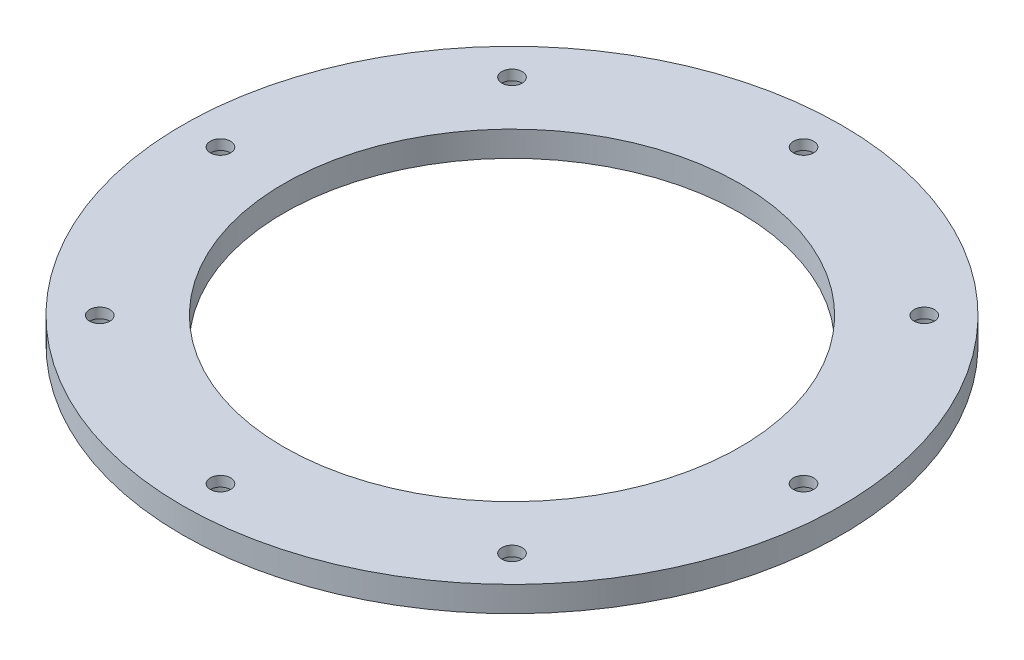
ISO-10303-21;
HEADER;
FILE_DESCRIPTION(('STEP AP214'),'2;1');
FILE_NAME('part.step','',(''),(''),'','','');
FILE_SCHEMA(('AUTOMOTIVE_DESIGN { 1 0 10303 214 1 1 1 1 }'));
ENDSEC;
DATA;
#1=APPLICATION_CONTEXT('core data for automotive mechanical design processes');
#2=APPLICATION_PROTOCOL_DEFINITION('international standard','automotive_design',2000,#1);
#3=PRODUCT_CONTEXT('',#1,'mechanical');
#4=PRODUCT('Part','Part','',(#3));
#5=PRODUCT_RELATED_PRODUCT_CATEGORY('part','',(#4));
#6=PRODUCT_DEFINITION_FORMATION('','',#4);
#7=PRODUCT_DEFINITION_CONTEXT('part definition',#1,'design');
#8=PRODUCT_DEFINITION('design','',#6,#7);
#9=PRODUCT_DEFINITION_SHAPE('','',#8);
#10=(LENGTH_UNIT() NAMED_UNIT(*) SI_UNIT(.MILLI.,.METRE.));
#11=(NAMED_UNIT(*) PLANE_ANGLE_UNIT() SI_UNIT($,.RADIAN.));
#12=(NAMED_UNIT(*) SI_UNIT($,.STERADIAN.) SOLID_ANGLE_UNIT());
#13=UNCERTAINTY_MEASURE_WITH_UNIT(LENGTH_MEASURE(1.E-05),#10,'distance_accuracy_value','');
#14=(GEOMETRIC_REPRESENTATION_CONTEXT(3) GLOBAL_UNCERTAINTY_ASSIGNED_CONTEXT((#13)) GLOBAL_UNIT_ASSIGNED_CONTEXT((#10,
#11,#12)) REPRESENTATION_CONTEXT('',''));
#15=CARTESIAN_POINT('',(0.,0.,0.));
#16=DIRECTION('',(0.,0.,1.));
#17=DIRECTION('',(1.,0.,0.));
#18=AXIS2_PLACEMENT_3D('',#15,#16,#17);
#19=CARTESIAN_POINT('',(0.,10.,0.));
#20=DIRECTION('',(0.,1.,0.));
#21=DIRECTION('',(0.,0.,1.));
#22=AXIS2_PLACEMENT_3D('',#19,#20,#21);
#23=PLANE('',#22);
#24=CARTESIAN_POINT('',(115.,10.,-4.04593397457117E-13));
#25=DIRECTION('',(0.,1.,0.));
#26=DIRECTION('',(0.,0.,1.));
#27=AXIS2_PLACEMENT_3D('',#24,#25,#26);
#28=CIRCLE('',#27,4.);
#29=CARTESIAN_POINT('',(115.,10.,3.9999999999996));
#30=VERTEX_POINT('',#29);
#31=EDGE_CURVE('E161',#30,#30,#28,.F.);
#32=ORIENTED_EDGE('',*,*,#31,.T.);
#33=EDGE_LOOP('',(#32));
#34=FACE_BOUND('',#33,.T.);
#35=CARTESIAN_POINT('',(81.3172798364525,10.,-81.3172798364534));
#36=DIRECTION('',(0.,1.,0.));
#37=DIRECTION('',(0.,0.,1.));
#38=AXIS2_PLACEMENT_3D('',#35,#36,#37);
#39=CIRCLE('',#38,4.);
#40=CARTESIAN_POINT('',(81.3172798364525,10.,-77.3172798364534));
#41=VERTEX_POINT('',#40);
#42=EDGE_CURVE('E165',#41,#41,#39,.F.);
#43=ORIENTED_EDGE('',*,*,#42,.T.);
#44=EDGE_LOOP('',(#43));
#45=FACE_BOUND('',#44,.T.);
#46=CARTESIAN_POINT('',(0.,10.,-115.));
#47=DIRECTION('',(0.,1.,0.));
#48=DIRECTION('',(0.,0.,1.));
#49=AXIS2_PLACEMENT_3D('',#46,#47,#48);
#50=CIRCLE('',#49,4.);
#51=CARTESIAN_POINT('',(0.,10.,-111.));
#52=VERTEX_POINT('',#51);
#53=EDGE_CURVE('E169',#52,#52,#50,.F.);
#54=ORIENTED_EDGE('',*,*,#53,.T.);
#55=EDGE_LOOP('',(#54));
#56=FACE_BOUND('',#55,.T.);
#57=CARTESIAN_POINT('',(-81.3172798364537,10.,-81.3172798364523));
#58=DIRECTION('',(0.,1.,0.));
#59=DIRECTION('',(0.,0.,1.));
#60=AXIS2_PLACEMENT_3D('',#57,#58,#59);
#61=CIRCLE('',#60,4.);
#62=CARTESIAN_POINT('',(-81.3172798364537,10.,-77.3172798364523));
#63=VERTEX_POINT('',#62);
#64=EDGE_CURVE('E173',#63,#63,#61,.F.);
#65=ORIENTED_EDGE('',*,*,#64,.T.);
#66=EDGE_LOOP('',(#65));
#67=FACE_BOUND('',#66,.T.);
#68=CARTESIAN_POINT('',(-115.,10.,1.20763410539104E-12));
#69=DIRECTION('',(0.,1.,0.));
#70=DIRECTION('',(0.,0.,1.));
#71=AXIS2_PLACEMENT_3D('',#68,#69,#70);
#72=CIRCLE('',#71,4.);
#73=CARTESIAN_POINT('',(-115.,10.,4.00000000000121));
#74=VERTEX_POINT('',#73);
#75=EDGE_CURVE('E177',#74,#74,#72,.F.);
#76=ORIENTED_EDGE('',*,*,#75,.T.);
#77=EDGE_LOOP('',(#76));
#78=FACE_BOUND('',#77,.T.);
#79=CARTESIAN_POINT('',(-81.317279836452,10.,81.3172798364539));
#80=DIRECTION('',(0.,1.,0.));
#81=DIRECTION('',(0.,0.,1.));
#82=AXIS2_PLACEMENT_3D('',#79,#80,#81);
#83=CIRCLE('',#82,4.);
#84=CARTESIAN_POINT('',(-81.317279836452,10.,85.317279836454));
#85=VERTEX_POINT('',#84);
#86=EDGE_CURVE('E181',#85,#85,#83,.F.);
#87=ORIENTED_EDGE('',*,*,#86,.T.);
#88=EDGE_LOOP('',(#87));
#89=FACE_BOUND('',#88,.T.);
#90=CARTESIAN_POINT('',(81.3172798364531,10.,81.3172798364528));
#91=DIRECTION('',(0.,1.,0.));
#92=DIRECTION('',(0.,0.,1.));
#93=AXIS2_PLACEMENT_3D('',#90,#91,#92);
#94=CIRCLE('',#93,4.);
#95=CARTESIAN_POINT('',(81.3172798364531,10.,85.3172798364528));
#96=VERTEX_POINT('',#95);
#97=EDGE_CURVE('E65',#96,#96,#94,.F.);
#98=ORIENTED_EDGE('',*,*,#97,.T.);
#99=EDGE_LOOP('',(#98));
#100=FACE_BOUND('',#99,.T.);
#101=CARTESIAN_POINT('',(0.,10.,115.));
#102=DIRECTION('',(0.,1.,0.));
#103=DIRECTION('',(0.,0.,1.));
#104=AXIS2_PLACEMENT_3D('',#101,#102,#103);
#105=CIRCLE('',#104,4.);
#106=CARTESIAN_POINT('',(0.,10.,119.));
#107=VERTEX_POINT('',#106);
#108=EDGE_CURVE('E60',#107,#107,#105,.F.);
#109=ORIENTED_EDGE('',*,*,#108,.T.);
#110=EDGE_LOOP('',(#109));
#111=FACE_BOUND('',#110,.T.);
#112=CARTESIAN_POINT('',(0.,10.,0.));
#113=DIRECTION('',(0.,1.,0.));
#114=DIRECTION('',(0.,0.,1.));
#115=AXIS2_PLACEMENT_3D('',#112,#113,#114);
#116=CIRCLE('',#115,130.);
#117=CARTESIAN_POINT('',(0.,10.,130.));
#118=VERTEX_POINT('',#117);
#119=EDGE_CURVE('E10',#118,#118,#116,.T.);
#120=ORIENTED_EDGE('',*,*,#119,.T.);
#121=EDGE_LOOP('',(#120));
#122=FACE_BOUND('',#121,.T.);
#123=CARTESIAN_POINT('',(0.,10.,0.));
#124=DIRECTION('',(0.,1.,0.));
#125=DIRECTION('',(0.,0.,1.));
#126=AXIS2_PLACEMENT_3D('',#123,#124,#125);
#127=CIRCLE('',#126,90.);
#128=CARTESIAN_POINT('',(0.,10.,90.));
#129=VERTEX_POINT('',#128);
#130=EDGE_CURVE('E50',#129,#129,#127,.T.);
#131=ORIENTED_EDGE('',*,*,#130,.F.);
#132=EDGE_LOOP('',(#131));
#133=FACE_BOUND('',#132,.T.);
#134=ADVANCED_FACE('F37',(#34,#45,#56,#67,#78,#89,#100,#111,#122,#133),#23,.T.);
#135=CARTESIAN_POINT('',(0.,0.,0.));
#136=DIRECTION('',(0.,1.,0.));
#137=DIRECTION('',(0.,0.,1.));
#138=AXIS2_PLACEMENT_3D('',#135,#136,#137);
#139=PLANE('',#138);
#140=CARTESIAN_POINT('',(115.,0.,-4.04593397457117E-13));
#141=DIRECTION('',(0.,-1.,0.));
#142=DIRECTION('',(-1.,0.,0.));
#143=AXIS2_PLACEMENT_3D('',#140,#141,#142);
#144=CIRCLE('',#143,7.5);
#145=CARTESIAN_POINT('',(107.5,0.,-3.78407287415793E-13));
#146=VERTEX_POINT('',#145);
#147=EDGE_CURVE('E98',#146,#146,#144,.T.);
#148=ORIENTED_EDGE('',*,*,#147,.F.);
#149=EDGE_LOOP('',(#148));
#150=FACE_BOUND('',#149,.T.);
#151=CARTESIAN_POINT('',(81.3172798364525,0.,-81.3172798364534));
#152=DIRECTION('',(0.,-1.,0.));
#153=DIRECTION('',(-0.707106781186544,0.,0.707106781186551));
#154=AXIS2_PLACEMENT_3D('',#151,#152,#153);
#155=CIRCLE('',#154,7.5);
#156=CARTESIAN_POINT('',(76.0139789775535,0.,-76.0139789775543));
#157=VERTEX_POINT('',#156);
#158=EDGE_CURVE('E104',#157,#157,#155,.T.);
#159=ORIENTED_EDGE('',*,*,#158,.F.);
#160=EDGE_LOOP('',(#159));
#161=FACE_BOUND('',#160,.T.);
#162=CARTESIAN_POINT('',(0.,0.,-115.));
#163=DIRECTION('',(0.,-1.,0.));
#164=DIRECTION('',(0.,0.,1.));
#165=AXIS2_PLACEMENT_3D('',#162,#163,#164);
#166=CIRCLE('',#165,7.5);
#167=CARTESIAN_POINT('',(0.,0.,-107.5));
#168=VERTEX_POINT('',#167);
#169=EDGE_CURVE('E110',#168,#168,#166,.T.);
#170=ORIENTED_EDGE('',*,*,#169,.F.);
#171=EDGE_LOOP('',(#170));
#172=FACE_BOUND('',#171,.T.);
#173=CARTESIAN_POINT('',(-81.3172798364537,0.,-81.3172798364523));
#174=DIRECTION('',(0.,-1.,0.));
#175=DIRECTION('',(0.707106781186554,0.,0.707106781186541));
#176=AXIS2_PLACEMENT_3D('',#173,#174,#175);
#177=CIRCLE('',#176,7.5);
#178=CARTESIAN_POINT('',(-76.0139789775545,0.,-76.0139789775532));
#179=VERTEX_POINT('',#178);
#180=EDGE_CURVE('E116',#179,#179,#177,.T.);
#181=ORIENTED_EDGE('',*,*,#180,.F.);
#182=EDGE_LOOP('',(#181));
#183=FACE_BOUND('',#182,.T.);
#184=CARTESIAN_POINT('',(-115.,0.,1.20763410539104E-12));
#185=DIRECTION('',(0.,-1.,0.));
#186=DIRECTION('',(1.,0.,0.));
#187=AXIS2_PLACEMENT_3D('',#184,#185,#186);
#188=CIRCLE('',#187,7.5);
#189=CARTESIAN_POINT('',(-107.5,0.,1.12907577526707E-12));
#190=VERTEX_POINT('',#189);
#191=EDGE_CURVE('E90',#190,#190,#188,.T.);
#192=ORIENTED_EDGE('',*,*,#191,.F.);
#193=EDGE_LOOP('',(#192));
#194=FACE_BOUND('',#193,.T.);
#195=CARTESIAN_POINT('',(-81.317279836452,0.,81.3172798364539));
#196=DIRECTION('',(0.,-1.,0.));
#197=DIRECTION('',(0.707106781186539,0.,-0.707106781186556));
#198=AXIS2_PLACEMENT_3D('',#195,#196,#197);
#199=CIRCLE('',#198,7.5);
#200=CARTESIAN_POINT('',(-76.0139789775529,0.,76.0139789775548));
#201=VERTEX_POINT('',#200);
#202=EDGE_CURVE('E81',#201,#201,#199,.T.);
#203=ORIENTED_EDGE('',*,*,#202,.F.);
#204=EDGE_LOOP('',(#203));
#205=FACE_BOUND('',#204,.T.);
#206=CARTESIAN_POINT('',(81.3172798364531,0.,81.3172798364528));
#207=DIRECTION('',(0.,-1.,0.));
#208=DIRECTION('',(-0.707106781186549,0.,-0.707106781186546));
#209=AXIS2_PLACEMENT_3D('',#206,#207,#208);
#210=CIRCLE('',#209,7.5);
#211=CARTESIAN_POINT('',(76.013978977554,0.,76.0139789775537));
#212=VERTEX_POINT('',#211);
#213=EDGE_CURVE('E97',#212,#212,#210,.T.);
#214=ORIENTED_EDGE('',*,*,#213,.F.);
#215=EDGE_LOOP('',(#214));
#216=FACE_BOUND('',#215,.T.);
#217=CARTESIAN_POINT('',(0.,0.,115.));
#218=DIRECTION('',(0.,-1.,0.));
#219=DIRECTION('',(0.,0.,-1.));
#220=AXIS2_PLACEMENT_3D('',#217,#218,#219);
#221=CIRCLE('',#220,7.5);
#222=CARTESIAN_POINT('',(0.,0.,107.5));
#223=VERTEX_POINT('',#222);
#224=EDGE_CURVE('E59',#223,#223,#221,.T.);
#225=ORIENTED_EDGE('',*,*,#224,.F.);
#226=EDGE_LOOP('',(#225));
#227=FACE_BOUND('',#226,.T.);
#228=CARTESIAN_POINT('',(0.,0.,0.));
#229=DIRECTION('',(0.,1.,0.));
#230=DIRECTION('',(0.,0.,1.));
#231=AXIS2_PLACEMENT_3D('',#228,#229,#230);
#232=CIRCLE('',#231,130.);
#233=CARTESIAN_POINT('',(0.,0.,130.));
#234=VERTEX_POINT('',#233);
#235=EDGE_CURVE('E45',#234,#234,#232,.T.);
#236=ORIENTED_EDGE('',*,*,#235,.F.);
#237=EDGE_LOOP('',(#236));
#238=FACE_BOUND('',#237,.T.);
#239=CARTESIAN_POINT('',(0.,0.,0.));
#240=DIRECTION('',(0.,1.,0.));
#241=DIRECTION('',(0.,0.,1.));
#242=AXIS2_PLACEMENT_3D('',#239,#240,#241);
#243=CIRCLE('',#242,90.);
#244=CARTESIAN_POINT('',(0.,0.,90.));
#245=VERTEX_POINT('',#244);
#246=EDGE_CURVE('E53',#245,#245,#243,.T.);
#247=ORIENTED_EDGE('',*,*,#246,.T.);
#248=EDGE_LOOP('',(#247));
#249=FACE_BOUND('',#248,.T.);
#250=ADVANCED_FACE('F137',(#150,#161,#172,#183,#194,#205,#216,#227,#238,#249),#139,.F.);
#251=CARTESIAN_POINT('',(0.,10.,0.));
#252=DIRECTION('',(0.,-1.,0.));
#253=DIRECTION('',(0.,0.,-1.));
#254=AXIS2_PLACEMENT_3D('',#251,#252,#253);
#255=CYLINDRICAL_SURFACE('',#254,130.);
#256=ORIENTED_EDGE('',*,*,#119,.F.);
#257=EDGE_LOOP('',(#256));
#258=FACE_BOUND('',#257,.T.);
#259=ORIENTED_EDGE('',*,*,#235,.T.);
#260=EDGE_LOOP('',(#259));
#261=FACE_BOUND('',#260,.T.);
#262=ADVANCED_FACE('F39',(#258,#261),#255,.T.);
#263=CARTESIAN_POINT('',(0.,10.,0.));
#264=DIRECTION('',(0.,-1.,0.));
#265=DIRECTION('',(0.,0.,-1.));
#266=AXIS2_PLACEMENT_3D('',#263,#264,#265);
#267=CYLINDRICAL_SURFACE('',#266,90.);
#268=ORIENTED_EDGE('',*,*,#130,.T.);
#269=EDGE_LOOP('',(#268));
#270=FACE_BOUND('',#269,.T.);
#271=ORIENTED_EDGE('',*,*,#246,.F.);
#272=EDGE_LOOP('',(#271));
#273=FACE_BOUND('',#272,.T.);
#274=ADVANCED_FACE('F139',(#270,#273),#267,.F.);
#275=CARTESIAN_POINT('',(0.,6.,115.));
#276=DIRECTION('',(0.,-1.,0.));
#277=DIRECTION('',(0.,0.,-1.));
#278=AXIS2_PLACEMENT_3D('',#275,#276,#277);
#279=CYLINDRICAL_SURFACE('',#278,7.5);
#280=CARTESIAN_POINT('',(0.,6.,115.));
#281=DIRECTION('',(0.,-1.,0.));
#282=DIRECTION('',(0.,0.,-1.));
#283=AXIS2_PLACEMENT_3D('',#280,#281,#282);
#284=CIRCLE('',#283,7.5);
#285=CARTESIAN_POINT('',(0.,6.,107.5));
#286=VERTEX_POINT('',#285);
#287=EDGE_CURVE('E127',#286,#286,#284,.T.);
#288=ORIENTED_EDGE('',*,*,#287,.F.);
#289=EDGE_LOOP('',(#288));
#290=FACE_BOUND('',#289,.T.);
#291=ORIENTED_EDGE('',*,*,#224,.T.);
#292=EDGE_LOOP('',(#291));
#293=FACE_BOUND('',#292,.T.);
#294=ADVANCED_FACE('F141',(#290,#293),#279,.F.);
#295=CARTESIAN_POINT('',(0.,6.,115.));
#296=DIRECTION('',(0.,-1.,0.));
#297=DIRECTION('',(0.,0.,-1.));
#298=AXIS2_PLACEMENT_3D('',#295,#296,#297);
#299=PLANE('',#298);
#300=CARTESIAN_POINT('',(0.,6.,115.));
#301=DIRECTION('',(0.,-1.,0.));
#302=DIRECTION('',(0.,0.,-1.));
#303=AXIS2_PLACEMENT_3D('',#300,#301,#302);
#304=CIRCLE('',#303,4.);
#305=CARTESIAN_POINT('',(0.,6.,111.));
#306=VERTEX_POINT('',#305);
#307=EDGE_CURVE('E56',#306,#306,#304,.F.);
#308=ORIENTED_EDGE('',*,*,#307,.T.);
#309=EDGE_LOOP('',(#308));
#310=FACE_BOUND('',#309,.T.);
#311=ORIENTED_EDGE('',*,*,#287,.T.);
#312=EDGE_LOOP('',(#311));
#313=FACE_BOUND('',#312,.T.);
#314=ADVANCED_FACE('F147',(#310,#313),#299,.T.);
#315=CARTESIAN_POINT('',(0.,0.,115.));
#316=DIRECTION('',(0.,1.,0.));
#317=DIRECTION('',(0.,0.,1.));
#318=AXIS2_PLACEMENT_3D('',#315,#316,#317);
#319=CYLINDRICAL_SURFACE('',#318,4.);
#320=ORIENTED_EDGE('',*,*,#307,.F.);
#321=EDGE_LOOP('',(#320));
#322=FACE_BOUND('',#321,.T.);
#323=ORIENTED_EDGE('',*,*,#108,.F.);
#324=EDGE_LOOP('',(#323));
#325=FACE_BOUND('',#324,.T.);
#326=ADVANCED_FACE('F188',(#322,#325),#319,.F.);
#327=CARTESIAN_POINT('',(81.3172798364531,6.,81.3172798364528));
#328=DIRECTION('',(0.,-1.,0.));
#329=DIRECTION('',(0.,0.,-1.));
#330=AXIS2_PLACEMENT_3D('',#327,#328,#329);
#331=CYLINDRICAL_SURFACE('',#330,7.5);
#332=CARTESIAN_POINT('',(81.3172798364531,6.,81.3172798364528));
#333=DIRECTION('',(0.,-1.,0.));
#334=DIRECTION('',(-0.707106781186549,0.,-0.707106781186546));
#335=AXIS2_PLACEMENT_3D('',#332,#333,#334);
#336=CIRCLE('',#335,7.5);
#337=CARTESIAN_POINT('',(76.013978977554,6.,76.0139789775537));
#338=VERTEX_POINT('',#337);
#339=EDGE_CURVE('E120',#338,#338,#336,.T.);
#340=ORIENTED_EDGE('',*,*,#339,.F.);
#341=EDGE_LOOP('',(#340));
#342=FACE_BOUND('',#341,.T.);
#343=ORIENTED_EDGE('',*,*,#213,.T.);
#344=EDGE_LOOP('',(#343));
#345=FACE_BOUND('',#344,.T.);
#346=ADVANCED_FACE('F190',(#342,#345),#331,.F.);
#347=CARTESIAN_POINT('',(81.3172798364531,6.,81.3172798364528));
#348=DIRECTION('',(0.,-1.,0.));
#349=DIRECTION('',(-0.707106781186549,0.,-0.707106781186546));
#350=AXIS2_PLACEMENT_3D('',#347,#348,#349);
#351=PLANE('',#350);
#352=CARTESIAN_POINT('',(81.3172798364531,6.,81.3172798364528));
#353=DIRECTION('',(0.,-1.,0.));
#354=DIRECTION('',(0.,0.,-1.));
#355=AXIS2_PLACEMENT_3D('',#352,#353,#354);
#356=CIRCLE('',#355,4.);
#357=CARTESIAN_POINT('',(81.3172798364531,6.,77.3172798364528));
#358=VERTEX_POINT('',#357);
#359=EDGE_CURVE('E41',#358,#358,#356,.F.);
#360=ORIENTED_EDGE('',*,*,#359,.T.);
#361=EDGE_LOOP('',(#360));
#362=FACE_BOUND('',#361,.T.);
#363=ORIENTED_EDGE('',*,*,#339,.T.);
#364=EDGE_LOOP('',(#363));
#365=FACE_BOUND('',#364,.T.);
#366=ADVANCED_FACE('F197',(#362,#365),#351,.T.);
#367=CARTESIAN_POINT('',(-81.317279836452,6.,81.3172798364539));
#368=DIRECTION('',(0.,-1.,0.));
#369=DIRECTION('',(0.,0.,-1.));
#370=AXIS2_PLACEMENT_3D('',#367,#368,#369);
#371=CYLINDRICAL_SURFACE('',#370,7.5);
#372=CARTESIAN_POINT('',(-81.317279836452,6.,81.3172798364539));
#373=DIRECTION('',(0.,-1.,0.));
#374=DIRECTION('',(0.707106781186539,0.,-0.707106781186556));
#375=AXIS2_PLACEMENT_3D('',#372,#373,#374);
#376=CIRCLE('',#375,7.5);
#377=CARTESIAN_POINT('',(-76.0139789775529,6.,76.0139789775548));
#378=VERTEX_POINT('',#377);
#379=EDGE_CURVE('E85',#378,#378,#376,.T.);
#380=ORIENTED_EDGE('',*,*,#379,.F.);
#381=EDGE_LOOP('',(#380));
#382=FACE_BOUND('',#381,.T.);
#383=ORIENTED_EDGE('',*,*,#202,.T.);
#384=EDGE_LOOP('',(#383));
#385=FACE_BOUND('',#384,.T.);
#386=ADVANCED_FACE('F206',(#382,#385),#371,.F.);
#387=CARTESIAN_POINT('',(-81.317279836452,6.,81.3172798364539));
#388=DIRECTION('',(0.,-1.,0.));
#389=DIRECTION('',(0.707106781186539,0.,-0.707106781186556));
#390=AXIS2_PLACEMENT_3D('',#387,#388,#389);
#391=PLANE('',#390);
#392=CARTESIAN_POINT('',(-81.317279836452,6.,81.3172798364539));
#393=DIRECTION('',(0.,-1.,0.));
#394=DIRECTION('',(0.,0.,-1.));
#395=AXIS2_PLACEMENT_3D('',#392,#393,#394);
#396=CIRCLE('',#395,4.);
#397=CARTESIAN_POINT('',(-81.317279836452,6.,77.3172798364539));
#398=VERTEX_POINT('',#397);
#399=EDGE_CURVE('E76',#398,#398,#396,.F.);
#400=ORIENTED_EDGE('',*,*,#399,.T.);
#401=EDGE_LOOP('',(#400));
#402=FACE_BOUND('',#401,.T.);
#403=ORIENTED_EDGE('',*,*,#379,.T.);
#404=EDGE_LOOP('',(#403));
#405=FACE_BOUND('',#404,.T.);
#406=ADVANCED_FACE('F243',(#402,#405),#391,.T.);
#407=CARTESIAN_POINT('',(-115.,6.,1.20763410539104E-12));
#408=DIRECTION('',(0.,-1.,0.));
#409=DIRECTION('',(0.,0.,-1.));
#410=AXIS2_PLACEMENT_3D('',#407,#408,#409);
#411=CYLINDRICAL_SURFACE('',#410,7.5);
#412=CARTESIAN_POINT('',(-115.,6.,1.20763410539104E-12));
#413=DIRECTION('',(0.,-1.,0.));
#414=DIRECTION('',(1.,0.,0.));
#415=AXIS2_PLACEMENT_3D('',#412,#413,#414);
#416=CIRCLE('',#415,7.5);
#417=CARTESIAN_POINT('',(-107.5,6.,1.12907577526707E-12));
#418=VERTEX_POINT('',#417);
#419=EDGE_CURVE('E119',#418,#418,#416,.T.);
#420=ORIENTED_EDGE('',*,*,#419,.F.);
#421=EDGE_LOOP('',(#420));
#422=FACE_BOUND('',#421,.T.);
#423=ORIENTED_EDGE('',*,*,#191,.T.);
#424=EDGE_LOOP('',(#423));
#425=FACE_BOUND('',#424,.T.);
#426=ADVANCED_FACE('F247',(#422,#425),#411,.F.);
#427=CARTESIAN_POINT('',(-115.,6.,1.20763410539104E-12));
#428=DIRECTION('',(0.,-1.,0.));
#429=DIRECTION('',(1.,0.,0.));
#430=AXIS2_PLACEMENT_3D('',#427,#428,#429);
#431=PLANE('',#430);
#432=CARTESIAN_POINT('',(-115.,6.,1.20763410539104E-12));
#433=DIRECTION('',(0.,-1.,0.));
#434=DIRECTION('',(0.,0.,-1.));
#435=AXIS2_PLACEMENT_3D('',#432,#433,#434);
#436=CIRCLE('',#435,4.);
#437=CARTESIAN_POINT('',(-115.,6.,-3.99999999999879));
#438=VERTEX_POINT('',#437);
#439=EDGE_CURVE('E74',#438,#438,#436,.F.);
#440=ORIENTED_EDGE('',*,*,#439,.T.);
#441=EDGE_LOOP('',(#440));
#442=FACE_BOUND('',#441,.T.);
#443=ORIENTED_EDGE('',*,*,#419,.T.);
#444=EDGE_LOOP('',(#443));
#445=FACE_BOUND('',#444,.T.);
#446=ADVANCED_FACE('F211',(#442,#445),#431,.T.);
#447=CARTESIAN_POINT('',(-81.3172798364537,6.,-81.3172798364523));
#448=DIRECTION('',(0.,-1.,0.));
#449=DIRECTION('',(0.,0.,-1.));
#450=AXIS2_PLACEMENT_3D('',#447,#448,#449);
#451=CYLINDRICAL_SURFACE('',#450,7.5);
#452=CARTESIAN_POINT('',(-81.3172798364537,6.,-81.3172798364523));
#453=DIRECTION('',(0.,-1.,0.));
#454=DIRECTION('',(0.707106781186554,0.,0.707106781186541));
#455=AXIS2_PLACEMENT_3D('',#452,#453,#454);
#456=CIRCLE('',#455,7.5);
#457=CARTESIAN_POINT('',(-76.0139789775545,6.,-76.0139789775532));
#458=VERTEX_POINT('',#457);
#459=EDGE_CURVE('E113',#458,#458,#456,.T.);
#460=ORIENTED_EDGE('',*,*,#459,.F.);
#461=EDGE_LOOP('',(#460));
#462=FACE_BOUND('',#461,.T.);
#463=ORIENTED_EDGE('',*,*,#180,.T.);
#464=EDGE_LOOP('',(#463));
#465=FACE_BOUND('',#464,.T.);
#466=ADVANCED_FACE('F207',(#462,#465),#451,.F.);
#467=CARTESIAN_POINT('',(-81.3172798364537,6.,-81.3172798364523));
#468=DIRECTION('',(0.,-1.,0.));
#469=DIRECTION('',(0.707106781186554,0.,0.707106781186541));
#470=AXIS2_PLACEMENT_3D('',#467,#468,#469);
#471=PLANE('',#470);
#472=CARTESIAN_POINT('',(-81.3172798364537,6.,-81.3172798364523));
#473=DIRECTION('',(0.,-1.,0.));
#474=DIRECTION('',(0.,0.,-1.));
#475=AXIS2_PLACEMENT_3D('',#472,#473,#474);
#476=CIRCLE('',#475,4.);
#477=CARTESIAN_POINT('',(-81.3172798364537,6.,-85.3172798364523));
#478=VERTEX_POINT('',#477);
#479=EDGE_CURVE('E71',#478,#478,#476,.F.);
#480=ORIENTED_EDGE('',*,*,#479,.T.);
#481=EDGE_LOOP('',(#480));
#482=FACE_BOUND('',#481,.T.);
#483=ORIENTED_EDGE('',*,*,#459,.T.);
#484=EDGE_LOOP('',(#483));
#485=FACE_BOUND('',#484,.T.);
#486=ADVANCED_FACE('F210',(#482,#485),#471,.T.);
#487=CARTESIAN_POINT('',(0.,6.,-115.));
#488=DIRECTION('',(0.,-1.,0.));
#489=DIRECTION('',(0.,0.,-1.));
#490=AXIS2_PLACEMENT_3D('',#487,#488,#489);
#491=CYLINDRICAL_SURFACE('',#490,7.5);
#492=CARTESIAN_POINT('',(0.,6.,-115.));
#493=DIRECTION('',(0.,-1.,0.));
#494=DIRECTION('',(0.,0.,1.));
#495=AXIS2_PLACEMENT_3D('',#492,#493,#494);
#496=CIRCLE('',#495,7.5);
#497=CARTESIAN_POINT('',(0.,6.,-107.5));
#498=VERTEX_POINT('',#497);
#499=EDGE_CURVE('E107',#498,#498,#496,.T.);
#500=ORIENTED_EDGE('',*,*,#499,.F.);
#501=EDGE_LOOP('',(#500));
#502=FACE_BOUND('',#501,.T.);
#503=ORIENTED_EDGE('',*,*,#169,.T.);
#504=EDGE_LOOP('',(#503));
#505=FACE_BOUND('',#504,.T.);
#506=ADVANCED_FACE('F215',(#502,#505),#491,.F.);
#507=CARTESIAN_POINT('',(0.,6.,-115.));
#508=DIRECTION('',(0.,-1.,0.));
#509=DIRECTION('',(0.,0.,1.));
#510=AXIS2_PLACEMENT_3D('',#507,#508,#509);
#511=PLANE('',#510);
#512=CARTESIAN_POINT('',(0.,6.,-115.));
#513=DIRECTION('',(0.,-1.,0.));
#514=DIRECTION('',(0.,0.,-1.));
#515=AXIS2_PLACEMENT_3D('',#512,#513,#514);
#516=CIRCLE('',#515,4.);
#517=CARTESIAN_POINT('',(0.,6.,-119.));
#518=VERTEX_POINT('',#517);
#519=EDGE_CURVE('E68',#518,#518,#516,.F.);
#520=ORIENTED_EDGE('',*,*,#519,.T.);
#521=EDGE_LOOP('',(#520));
#522=FACE_BOUND('',#521,.T.);
#523=ORIENTED_EDGE('',*,*,#499,.T.);
#524=EDGE_LOOP('',(#523));
#525=FACE_BOUND('',#524,.T.);
#526=ADVANCED_FACE('F219',(#522,#525),#511,.T.);
#527=CARTESIAN_POINT('',(81.3172798364525,6.,-81.3172798364534));
#528=DIRECTION('',(0.,-1.,0.));
#529=DIRECTION('',(0.,0.,-1.));
#530=AXIS2_PLACEMENT_3D('',#527,#528,#529);
#531=CYLINDRICAL_SURFACE('',#530,7.5);
#532=CARTESIAN_POINT('',(81.3172798364525,6.,-81.3172798364534));
#533=DIRECTION('',(0.,-1.,0.));
#534=DIRECTION('',(-0.707106781186544,0.,0.707106781186551));
#535=AXIS2_PLACEMENT_3D('',#532,#533,#534);
#536=CIRCLE('',#535,7.5);
#537=CARTESIAN_POINT('',(76.0139789775535,6.,-76.0139789775543));
#538=VERTEX_POINT('',#537);
#539=EDGE_CURVE('E101',#538,#538,#536,.T.);
#540=ORIENTED_EDGE('',*,*,#539,.F.);
#541=EDGE_LOOP('',(#540));
#542=FACE_BOUND('',#541,.T.);
#543=ORIENTED_EDGE('',*,*,#158,.T.);
#544=EDGE_LOOP('',(#543));
#545=FACE_BOUND('',#544,.T.);
#546=ADVANCED_FACE('F223',(#542,#545),#531,.F.);
#547=CARTESIAN_POINT('',(81.3172798364525,6.,-81.3172798364534));
#548=DIRECTION('',(0.,-1.,0.));
#549=DIRECTION('',(-0.707106781186544,0.,0.707106781186551));
#550=AXIS2_PLACEMENT_3D('',#547,#548,#549);
#551=PLANE('',#550);
#552=CARTESIAN_POINT('',(81.3172798364525,6.,-81.3172798364534));
#553=DIRECTION('',(0.,-1.,0.));
#554=DIRECTION('',(0.,0.,-1.));
#555=AXIS2_PLACEMENT_3D('',#552,#553,#554);
#556=CIRCLE('',#555,4.);
#557=CARTESIAN_POINT('',(81.3172798364525,6.,-85.3172798364534));
#558=VERTEX_POINT('',#557);
#559=EDGE_CURVE('E64',#558,#558,#556,.F.);
#560=ORIENTED_EDGE('',*,*,#559,.T.);
#561=EDGE_LOOP('',(#560));
#562=FACE_BOUND('',#561,.T.);
#563=ORIENTED_EDGE('',*,*,#539,.T.);
#564=EDGE_LOOP('',(#563));
#565=FACE_BOUND('',#564,.T.);
#566=ADVANCED_FACE('F227',(#562,#565),#551,.T.);
#567=CARTESIAN_POINT('',(115.,6.,-4.04593397457117E-13));
#568=DIRECTION('',(0.,-1.,0.));
#569=DIRECTION('',(0.,0.,-1.));
#570=AXIS2_PLACEMENT_3D('',#567,#568,#569);
#571=CYLINDRICAL_SURFACE('',#570,7.5);
#572=CARTESIAN_POINT('',(115.,6.,-4.04593397457117E-13));
#573=DIRECTION('',(0.,-1.,0.));
#574=DIRECTION('',(-1.,0.,0.));
#575=AXIS2_PLACEMENT_3D('',#572,#573,#574);
#576=CIRCLE('',#575,7.5);
#577=CARTESIAN_POINT('',(107.5,6.,-3.78407287415793E-13));
#578=VERTEX_POINT('',#577);
#579=EDGE_CURVE('E94',#578,#578,#576,.T.);
#580=ORIENTED_EDGE('',*,*,#579,.F.);
#581=EDGE_LOOP('',(#580));
#582=FACE_BOUND('',#581,.T.);
#583=ORIENTED_EDGE('',*,*,#147,.T.);
#584=EDGE_LOOP('',(#583));
#585=FACE_BOUND('',#584,.T.);
#586=ADVANCED_FACE('F231',(#582,#585),#571,.F.);
#587=CARTESIAN_POINT('',(115.,6.,-4.04593397457117E-13));
#588=DIRECTION('',(0.,-1.,0.));
#589=DIRECTION('',(-1.,0.,0.));
#590=AXIS2_PLACEMENT_3D('',#587,#588,#589);
#591=PLANE('',#590);
#592=CARTESIAN_POINT('',(115.,6.,-4.04593397457117E-13));
#593=DIRECTION('',(0.,-1.,0.));
#594=DIRECTION('',(0.,0.,-1.));
#595=AXIS2_PLACEMENT_3D('',#592,#593,#594);
#596=CIRCLE('',#595,4.);
#597=CARTESIAN_POINT('',(115.,6.,-4.00000000000041));
#598=VERTEX_POINT('',#597);
#599=EDGE_CURVE('E61',#598,#598,#596,.F.);
#600=ORIENTED_EDGE('',*,*,#599,.T.);
#601=EDGE_LOOP('',(#600));
#602=FACE_BOUND('',#601,.T.);
#603=ORIENTED_EDGE('',*,*,#579,.T.);
#604=EDGE_LOOP('',(#603));
#605=FACE_BOUND('',#604,.T.);
#606=ADVANCED_FACE('F235',(#602,#605),#591,.T.);
#607=CARTESIAN_POINT('',(115.,0.,-4.04593397457117E-13));
#608=DIRECTION('',(0.,1.,0.));
#609=DIRECTION('',(0.,0.,1.));
#610=AXIS2_PLACEMENT_3D('',#607,#608,#609);
#611=CYLINDRICAL_SURFACE('',#610,4.);
#612=ORIENTED_EDGE('',*,*,#599,.F.);
#613=EDGE_LOOP('',(#612));
#614=FACE_BOUND('',#613,.T.);
#615=ORIENTED_EDGE('',*,*,#31,.F.);
#616=EDGE_LOOP('',(#615));
#617=FACE_BOUND('',#616,.T.);
#618=ADVANCED_FACE('F239',(#614,#617),#611,.F.);
#619=CARTESIAN_POINT('',(81.3172798364525,0.,-81.3172798364534));
#620=DIRECTION('',(0.,1.,0.));
#621=DIRECTION('',(0.,0.,1.));
#622=AXIS2_PLACEMENT_3D('',#619,#620,#621);
#623=CYLINDRICAL_SURFACE('',#622,4.);
#624=ORIENTED_EDGE('',*,*,#559,.F.);
#625=EDGE_LOOP('',(#624));
#626=FACE_BOUND('',#625,.T.);
#627=ORIENTED_EDGE('',*,*,#42,.F.);
#628=EDGE_LOOP('',(#627));
#629=FACE_BOUND('',#628,.T.);
#630=ADVANCED_FACE('F267',(#626,#629),#623,.F.);
#631=CARTESIAN_POINT('',(0.,0.,-115.));
#632=DIRECTION('',(0.,1.,0.));
#633=DIRECTION('',(0.,0.,1.));
#634=AXIS2_PLACEMENT_3D('',#631,#632,#633);
#635=CYLINDRICAL_SURFACE('',#634,4.);
#636=ORIENTED_EDGE('',*,*,#519,.F.);
#637=EDGE_LOOP('',(#636));
#638=FACE_BOUND('',#637,.T.);
#639=ORIENTED_EDGE('',*,*,#53,.F.);
#640=EDGE_LOOP('',(#639));
#641=FACE_BOUND('',#640,.T.);
#642=ADVANCED_FACE('F263',(#638,#641),#635,.F.);
#643=CARTESIAN_POINT('',(-81.3172798364537,0.,-81.3172798364523));
#644=DIRECTION('',(0.,1.,0.));
#645=DIRECTION('',(0.,0.,1.));
#646=AXIS2_PLACEMENT_3D('',#643,#644,#645);
#647=CYLINDRICAL_SURFACE('',#646,4.);
#648=ORIENTED_EDGE('',*,*,#479,.F.);
#649=EDGE_LOOP('',(#648));
#650=FACE_BOUND('',#649,.T.);
#651=ORIENTED_EDGE('',*,*,#64,.F.);
#652=EDGE_LOOP('',(#651));
#653=FACE_BOUND('',#652,.T.);
#654=ADVANCED_FACE('F259',(#650,#653),#647,.F.);
#655=CARTESIAN_POINT('',(-115.,0.,1.20763410539104E-12));
#656=DIRECTION('',(0.,1.,0.));
#657=DIRECTION('',(0.,0.,1.));
#658=AXIS2_PLACEMENT_3D('',#655,#656,#657);
#659=CYLINDRICAL_SURFACE('',#658,4.);
#660=ORIENTED_EDGE('',*,*,#439,.F.);
#661=EDGE_LOOP('',(#660));
#662=FACE_BOUND('',#661,.T.);
#663=ORIENTED_EDGE('',*,*,#75,.F.);
#664=EDGE_LOOP('',(#663));
#665=FACE_BOUND('',#664,.T.);
#666=ADVANCED_FACE('F262',(#662,#665),#659,.F.);
#667=CARTESIAN_POINT('',(-81.317279836452,0.,81.3172798364539));
#668=DIRECTION('',(0.,1.,0.));
#669=DIRECTION('',(0.,0.,1.));
#670=AXIS2_PLACEMENT_3D('',#667,#668,#669);
#671=CYLINDRICAL_SURFACE('',#670,4.);
#672=ORIENTED_EDGE('',*,*,#399,.F.);
#673=EDGE_LOOP('',(#672));
#674=FACE_BOUND('',#673,.T.);
#675=ORIENTED_EDGE('',*,*,#86,.F.);
#676=EDGE_LOOP('',(#675));
#677=FACE_BOUND('',#676,.T.);
#678=ADVANCED_FACE('F257',(#674,#677),#671,.F.);
#679=CARTESIAN_POINT('',(81.3172798364531,0.,81.3172798364528));
#680=DIRECTION('',(0.,1.,0.));
#681=DIRECTION('',(0.,0.,1.));
#682=AXIS2_PLACEMENT_3D('',#679,#680,#681);
#683=CYLINDRICAL_SURFACE('',#682,4.);
#684=ORIENTED_EDGE('',*,*,#359,.F.);
#685=EDGE_LOOP('',(#684));
#686=FACE_BOUND('',#685,.T.);
#687=ORIENTED_EDGE('',*,*,#97,.F.);
#688=EDGE_LOOP('',(#687));
#689=FACE_BOUND('',#688,.T.);
#690=ADVANCED_FACE('F254',(#686,#689),#683,.F.);
#691=CLOSED_SHELL('',(#134,#250,#262,#274,#294,#314,#326,#346,#366,#386,#406,#426,#446,#466,
#486,#506,#526,#546,#566,#586,#606,#618,#630,#642,#654,#666,#678,#690));
#692=MANIFOLD_SOLID_BREP('B2',#691);
#693=ADVANCED_BREP_SHAPE_REPRESENTATION('',(#18,#692),#14);
#694=SHAPE_DEFINITION_REPRESENTATION(#9,#693);
ENDSEC;
END-ISO-10303-21;
